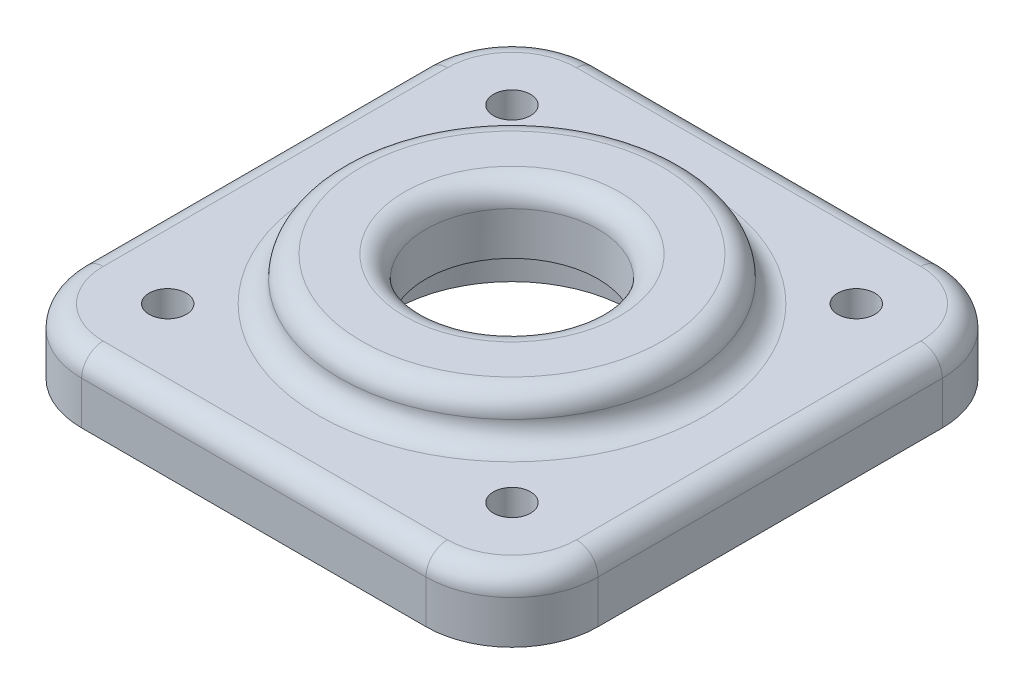
ISO-10303-21;
HEADER;
FILE_DESCRIPTION(('STEP AP214'),'2;1');
FILE_NAME('part.step','',(''),(''),'','','');
FILE_SCHEMA(('AUTOMOTIVE_DESIGN { 1 0 10303 214 1 1 1 1 }'));
ENDSEC;
DATA;
#1=APPLICATION_CONTEXT('core data for automotive mechanical design processes');
#2=APPLICATION_PROTOCOL_DEFINITION('international standard','automotive_design',2000,#1);
#3=PRODUCT_CONTEXT('',#1,'mechanical');
#4=PRODUCT('Part','Part','',(#3));
#5=PRODUCT_RELATED_PRODUCT_CATEGORY('part','',(#4));
#6=PRODUCT_DEFINITION_FORMATION('','',#4);
#7=PRODUCT_DEFINITION_CONTEXT('part definition',#1,'design');
#8=PRODUCT_DEFINITION('design','',#6,#7);
#9=PRODUCT_DEFINITION_SHAPE('','',#8);
#10=(LENGTH_UNIT() NAMED_UNIT(*) SI_UNIT(.MILLI.,.METRE.));
#11=(NAMED_UNIT(*) PLANE_ANGLE_UNIT() SI_UNIT($,.RADIAN.));
#12=(NAMED_UNIT(*) SI_UNIT($,.STERADIAN.) SOLID_ANGLE_UNIT());
#13=UNCERTAINTY_MEASURE_WITH_UNIT(LENGTH_MEASURE(1.E-05),#10,'distance_accuracy_value','');
#14=(GEOMETRIC_REPRESENTATION_CONTEXT(3) GLOBAL_UNCERTAINTY_ASSIGNED_CONTEXT((#13)) GLOBAL_UNIT_ASSIGNED_CONTEXT((#10,
#11,#12)) REPRESENTATION_CONTEXT('',''));
#15=CARTESIAN_POINT('',(0.,0.,0.));
#16=DIRECTION('',(0.,0.,1.));
#17=DIRECTION('',(1.,0.,0.));
#18=AXIS2_PLACEMENT_3D('',#15,#16,#17);
#19=CARTESIAN_POINT('',(-8.,3.,-8.));
#20=DIRECTION('',(0.,1.,0.));
#21=DIRECTION('',(0.,0.,1.));
#22=AXIS2_PLACEMENT_3D('',#19,#20,#21);
#23=PLANE('',#22);
#24=DIRECTION('',(1.,0.,0.));
#25=VECTOR('',#24,1.);
#26=CARTESIAN_POINT('',(7.99999999999998,3.,10.9999999999995));
#27=LINE('',#26,#25);
#28=CARTESIAN_POINT('',(-7.99999999999997,3.,10.9999999999995));
#29=VERTEX_POINT('',#28);
#30=CARTESIAN_POINT('',(7.99999999999998,3.,10.9999999999995));
#31=VERTEX_POINT('',#30);
#32=EDGE_CURVE('E200',#29,#31,#27,.T.);
#33=ORIENTED_EDGE('',*,*,#32,.T.);
#34=CARTESIAN_POINT('',(8.,3.,7.99999999999955));
#35=DIRECTION('',(0.,1.,0.));
#36=DIRECTION('',(0.,0.,1.));
#37=AXIS2_PLACEMENT_3D('',#34,#35,#36);
#38=CIRCLE('',#37,3.);
#39=CARTESIAN_POINT('',(11.,3.,7.99999999999953));
#40=VERTEX_POINT('',#39);
#41=EDGE_CURVE('E202',#31,#40,#38,.T.);
#42=ORIENTED_EDGE('',*,*,#41,.T.);
#43=DIRECTION('',(0.,0.,-1.));
#44=VECTOR('',#43,1.);
#45=CARTESIAN_POINT('',(11.,3.,-7.99999999999997));
#46=LINE('',#45,#44);
#47=CARTESIAN_POINT('',(11.,3.,-7.99999999999998));
#48=VERTEX_POINT('',#47);
#49=EDGE_CURVE('E188',#40,#48,#46,.T.);
#50=ORIENTED_EDGE('',*,*,#49,.T.);
#51=CARTESIAN_POINT('',(8.,3.,-8.));
#52=DIRECTION('',(0.,1.,0.));
#53=DIRECTION('',(0.,0.,1.));
#54=AXIS2_PLACEMENT_3D('',#51,#52,#53);
#55=CIRCLE('',#54,3.);
#56=CARTESIAN_POINT('',(7.99999999999998,3.,-11.));
#57=VERTEX_POINT('',#56);
#58=EDGE_CURVE('E190',#48,#57,#55,.T.);
#59=ORIENTED_EDGE('',*,*,#58,.T.);
#60=DIRECTION('',(-1.,0.,0.));
#61=VECTOR('',#60,1.);
#62=CARTESIAN_POINT('',(-7.99999999999997,3.,-11.));
#63=LINE('',#62,#61);
#64=CARTESIAN_POINT('',(-7.99999999999998,3.,-11.));
#65=VERTEX_POINT('',#64);
#66=EDGE_CURVE('E192',#57,#65,#63,.T.);
#67=ORIENTED_EDGE('',*,*,#66,.T.);
#68=CARTESIAN_POINT('',(-8.,3.,-8.));
#69=DIRECTION('',(0.,1.,0.));
#70=DIRECTION('',(0.,0.,1.));
#71=AXIS2_PLACEMENT_3D('',#68,#69,#70);
#72=CIRCLE('',#71,3.);
#73=CARTESIAN_POINT('',(-11.,3.,-7.99999999999997));
#74=VERTEX_POINT('',#73);
#75=EDGE_CURVE('E194',#65,#74,#72,.T.);
#76=ORIENTED_EDGE('',*,*,#75,.T.);
#77=DIRECTION('',(0.,0.,1.));
#78=VECTOR('',#77,1.);
#79=CARTESIAN_POINT('',(-11.,3.,7.99999999999952));
#80=LINE('',#79,#78);
#81=CARTESIAN_POINT('',(-11.,3.,7.99999999999953));
#82=VERTEX_POINT('',#81);
#83=EDGE_CURVE('E196',#74,#82,#80,.T.);
#84=ORIENTED_EDGE('',*,*,#83,.T.);
#85=CARTESIAN_POINT('',(-8.,3.,7.99999999999955));
#86=DIRECTION('',(0.,1.,0.));
#87=DIRECTION('',(0.,0.,1.));
#88=AXIS2_PLACEMENT_3D('',#85,#86,#87);
#89=CIRCLE('',#88,3.);
#90=EDGE_CURVE('E198',#82,#29,#89,.T.);
#91=ORIENTED_EDGE('',*,*,#90,.T.);
#92=EDGE_LOOP('',(#33,#42,#50,#59,#67,#76,#84,#91));
#93=FACE_BOUND('',#92,.T.);
#94=CARTESIAN_POINT('',(0.,3.,0.));
#95=DIRECTION('',(0.,1.,0.));
#96=DIRECTION('',(0.,0.,1.));
#97=AXIS2_PLACEMENT_3D('',#94,#95,#96);
#98=CIRCLE('',#97,9.);
#99=CARTESIAN_POINT('',(0.,3.,9.));
#100=VERTEX_POINT('',#99);
#101=EDGE_CURVE('E136',#100,#100,#98,.F.);
#102=ORIENTED_EDGE('',*,*,#101,.T.);
#103=EDGE_LOOP('',(#102));
#104=FACE_BOUND('',#103,.T.);
#105=CARTESIAN_POINT('',(-7.99999999999955,3.,8.00000000000001));
#106=DIRECTION('',(0.,1.,0.));
#107=DIRECTION('',(0.,0.,1.));
#108=AXIS2_PLACEMENT_3D('',#105,#106,#107);
#109=CIRCLE('',#108,0.861723990727093);
#110=CARTESIAN_POINT('',(-7.99999999999955,3.,8.8617239907271));
#111=VERTEX_POINT('',#110);
#112=EDGE_CURVE('E259',#111,#111,#109,.T.);
#113=ORIENTED_EDGE('',*,*,#112,.F.);
#114=EDGE_LOOP('',(#113));
#115=FACE_BOUND('',#114,.T.);
#116=CARTESIAN_POINT('',(8.,3.,-8.00000000000045));
#117=DIRECTION('',(0.,1.,0.));
#118=DIRECTION('',(0.,0.,1.));
#119=AXIS2_PLACEMENT_3D('',#116,#117,#118);
#120=CIRCLE('',#119,0.861723990727318);
#121=CARTESIAN_POINT('',(8.,3.,-7.13827600927313));
#122=VERTEX_POINT('',#121);
#123=EDGE_CURVE('E271',#122,#122,#120,.T.);
#124=ORIENTED_EDGE('',*,*,#123,.F.);
#125=EDGE_LOOP('',(#124));
#126=FACE_BOUND('',#125,.T.);
#127=CARTESIAN_POINT('',(-8.,3.,-8.));
#128=DIRECTION('',(0.,1.,0.));
#129=DIRECTION('',(0.,0.,1.));
#130=AXIS2_PLACEMENT_3D('',#127,#128,#129);
#131=CIRCLE('',#130,0.861723990726853);
#132=CARTESIAN_POINT('',(-8.,3.,-7.13827600927315));
#133=VERTEX_POINT('',#132);
#134=EDGE_CURVE('E152',#133,#133,#131,.T.);
#135=ORIENTED_EDGE('',*,*,#134,.F.);
#136=EDGE_LOOP('',(#135));
#137=FACE_BOUND('',#136,.T.);
#138=CARTESIAN_POINT('',(8.00000000000045,3.,7.99999999999955));
#139=DIRECTION('',(0.,1.,0.));
#140=DIRECTION('',(0.,0.,1.));
#141=AXIS2_PLACEMENT_3D('',#138,#139,#140);
#142=CIRCLE('',#141,0.861723990727488);
#143=CARTESIAN_POINT('',(8.00000000000045,3.,8.86172399072704));
#144=VERTEX_POINT('',#143);
#145=EDGE_CURVE('E265',#144,#144,#142,.T.);
#146=ORIENTED_EDGE('',*,*,#145,.F.);
#147=EDGE_LOOP('',(#146));
#148=FACE_BOUND('',#147,.T.);
#149=ADVANCED_FACE('F35',(#93,#104,#115,#126,#137,#148),#23,.T.);
#150=CARTESIAN_POINT('',(-8.,0.,-8.));
#151=DIRECTION('',(0.,1.,0.));
#152=DIRECTION('',(0.,0.,1.));
#153=AXIS2_PLACEMENT_3D('',#150,#151,#152);
#154=PLANE('',#153);
#155=CARTESIAN_POINT('',(8.00000000000045,0.,7.99999999999955));
#156=DIRECTION('',(0.,1.,0.));
#157=DIRECTION('',(0.,0.,1.));
#158=AXIS2_PLACEMENT_3D('',#155,#156,#157);
#159=CIRCLE('',#158,0.861723990727488);
#160=CARTESIAN_POINT('',(8.00000000000045,0.,8.86172399072704));
#161=VERTEX_POINT('',#160);
#162=EDGE_CURVE('E262',#161,#161,#159,.T.);
#163=ORIENTED_EDGE('',*,*,#162,.T.);
#164=EDGE_LOOP('',(#163));
#165=FACE_BOUND('',#164,.T.);
#166=CARTESIAN_POINT('',(0.,0.,0.));
#167=DIRECTION('',(0.,1.,0.));
#168=DIRECTION('',(0.,0.,1.));
#169=AXIS2_PLACEMENT_3D('',#166,#167,#168);
#170=CIRCLE('',#169,5.5);
#171=CARTESIAN_POINT('',(0.,0.,5.5));
#172=VERTEX_POINT('',#171);
#173=EDGE_CURVE('E274',#172,#172,#170,.T.);
#174=ORIENTED_EDGE('',*,*,#173,.T.);
#175=EDGE_LOOP('',(#174));
#176=FACE_BOUND('',#175,.T.);
#177=CARTESIAN_POINT('',(-8.,0.,-8.));
#178=DIRECTION('',(0.,1.,0.));
#179=DIRECTION('',(0.,0.,1.));
#180=AXIS2_PLACEMENT_3D('',#177,#178,#179);
#181=CIRCLE('',#180,4.);
#182=CARTESIAN_POINT('',(-7.99999999999997,0.,-12.));
#183=VERTEX_POINT('',#182);
#184=CARTESIAN_POINT('',(-12.,0.,-7.99999999999997));
#185=VERTEX_POINT('',#184);
#186=EDGE_CURVE('E144',#183,#185,#181,.T.);
#187=ORIENTED_EDGE('',*,*,#186,.F.);
#188=DIRECTION('',(-1.,0.,0.));
#189=VECTOR('',#188,1.);
#190=CARTESIAN_POINT('',(-7.99999999999997,0.,-12.));
#191=LINE('',#190,#189);
#192=CARTESIAN_POINT('',(7.99999999999998,0.,-12.));
#193=VERTEX_POINT('',#192);
#194=EDGE_CURVE('E172',#193,#183,#191,.T.);
#195=ORIENTED_EDGE('',*,*,#194,.F.);
#196=CARTESIAN_POINT('',(8.,0.,-8.));
#197=DIRECTION('',(0.,1.,0.));
#198=DIRECTION('',(0.,0.,-1.));
#199=AXIS2_PLACEMENT_3D('',#196,#197,#198);
#200=CIRCLE('',#199,4.);
#201=CARTESIAN_POINT('',(12.,0.,-7.99999999999997));
#202=VERTEX_POINT('',#201);
#203=EDGE_CURVE('E169',#202,#193,#200,.T.);
#204=ORIENTED_EDGE('',*,*,#203,.F.);
#205=DIRECTION('',(0.,0.,-1.));
#206=VECTOR('',#205,1.);
#207=CARTESIAN_POINT('',(12.,0.,-7.99999999999997));
#208=LINE('',#207,#206);
#209=CARTESIAN_POINT('',(12.,0.,7.99999999999952));
#210=VERTEX_POINT('',#209);
#211=EDGE_CURVE('E166',#210,#202,#208,.T.);
#212=ORIENTED_EDGE('',*,*,#211,.F.);
#213=CARTESIAN_POINT('',(8.,0.,7.99999999999955));
#214=DIRECTION('',(0.,1.,0.));
#215=DIRECTION('',(0.,0.,1.));
#216=AXIS2_PLACEMENT_3D('',#213,#214,#215);
#217=CIRCLE('',#216,4.);
#218=CARTESIAN_POINT('',(7.99999999999998,0.,11.9999999999995));
#219=VERTEX_POINT('',#218);
#220=EDGE_CURVE('E163',#219,#210,#217,.T.);
#221=ORIENTED_EDGE('',*,*,#220,.F.);
#222=DIRECTION('',(1.,0.,0.));
#223=VECTOR('',#222,1.);
#224=CARTESIAN_POINT('',(-7.99999999999997,0.,11.9999999999995));
#225=LINE('',#224,#223);
#226=CARTESIAN_POINT('',(-7.99999999999997,0.,11.9999999999995));
#227=VERTEX_POINT('',#226);
#228=EDGE_CURVE('E160',#227,#219,#225,.T.);
#229=ORIENTED_EDGE('',*,*,#228,.F.);
#230=CARTESIAN_POINT('',(-8.,0.,7.99999999999955));
#231=DIRECTION('',(0.,1.,0.));
#232=DIRECTION('',(0.,0.,1.));
#233=AXIS2_PLACEMENT_3D('',#230,#231,#232);
#234=CIRCLE('',#233,4.);
#235=CARTESIAN_POINT('',(-12.,0.,7.99999999999952));
#236=VERTEX_POINT('',#235);
#237=EDGE_CURVE('E147',#236,#227,#234,.T.);
#238=ORIENTED_EDGE('',*,*,#237,.F.);
#239=DIRECTION('',(0.,0.,1.));
#240=VECTOR('',#239,1.);
#241=CARTESIAN_POINT('',(-12.,0.,-7.99999999999997));
#242=LINE('',#241,#240);
#243=EDGE_CURVE('E129',#185,#236,#242,.T.);
#244=ORIENTED_EDGE('',*,*,#243,.F.);
#245=EDGE_LOOP('',(#187,#195,#204,#212,#221,#229,#238,#244));
#246=FACE_BOUND('',#245,.T.);
#247=CARTESIAN_POINT('',(-8.,0.,-8.));
#248=DIRECTION('',(0.,1.,0.));
#249=DIRECTION('',(0.,0.,1.));
#250=AXIS2_PLACEMENT_3D('',#247,#248,#249);
#251=CIRCLE('',#250,0.861723990726853);
#252=CARTESIAN_POINT('',(-8.,0.,-7.13827600927315));
#253=VERTEX_POINT('',#252);
#254=EDGE_CURVE('E155',#253,#253,#251,.T.);
#255=ORIENTED_EDGE('',*,*,#254,.T.);
#256=EDGE_LOOP('',(#255));
#257=FACE_BOUND('',#256,.T.);
#258=CARTESIAN_POINT('',(8.,0.,-8.00000000000045));
#259=DIRECTION('',(0.,1.,0.));
#260=DIRECTION('',(0.,0.,1.));
#261=AXIS2_PLACEMENT_3D('',#258,#259,#260);
#262=CIRCLE('',#261,0.861723990727318);
#263=CARTESIAN_POINT('',(8.,0.,-7.13827600927313));
#264=VERTEX_POINT('',#263);
#265=EDGE_CURVE('E268',#264,#264,#262,.T.);
#266=ORIENTED_EDGE('',*,*,#265,.T.);
#267=EDGE_LOOP('',(#266));
#268=FACE_BOUND('',#267,.T.);
#269=CARTESIAN_POINT('',(-7.99999999999955,0.,8.00000000000001));
#270=DIRECTION('',(0.,1.,0.));
#271=DIRECTION('',(0.,0.,1.));
#272=AXIS2_PLACEMENT_3D('',#269,#270,#271);
#273=CIRCLE('',#272,0.861723990727093);
#274=CARTESIAN_POINT('',(-7.99999999999955,0.,8.8617239907271));
#275=VERTEX_POINT('',#274);
#276=EDGE_CURVE('E249',#275,#275,#273,.T.);
#277=ORIENTED_EDGE('',*,*,#276,.T.);
#278=EDGE_LOOP('',(#277));
#279=FACE_BOUND('',#278,.T.);
#280=ADVANCED_FACE('F141',(#165,#176,#246,#257,#268,#279),#154,.F.);
#281=CARTESIAN_POINT('',(-8.,3.,-8.));
#282=DIRECTION('',(0.,-1.,0.));
#283=DIRECTION('',(0.,0.,-1.));
#284=AXIS2_PLACEMENT_3D('',#281,#282,#283);
#285=CYLINDRICAL_SURFACE('',#284,4.);
#286=DIRECTION('',(0.,-1.,0.));
#287=VECTOR('',#286,1.);
#288=CARTESIAN_POINT('',(-12.,3.,-7.99999999999997));
#289=LINE('',#288,#287);
#290=CARTESIAN_POINT('',(-12.,2.,-7.99999999999997));
#291=VERTEX_POINT('',#290);
#292=EDGE_CURVE('E125',#291,#185,#289,.T.);
#293=ORIENTED_EDGE('',*,*,#292,.F.);
#294=CARTESIAN_POINT('',(-8.,2.,-8.));
#295=DIRECTION('',(0.,1.,0.));
#296=DIRECTION('',(0.,0.,1.));
#297=AXIS2_PLACEMENT_3D('',#294,#295,#296);
#298=CIRCLE('',#297,4.);
#299=CARTESIAN_POINT('',(-7.99999999999997,2.,-12.));
#300=VERTEX_POINT('',#299);
#301=EDGE_CURVE('E213',#291,#300,#298,.F.);
#302=ORIENTED_EDGE('',*,*,#301,.T.);
#303=DIRECTION('',(0.,-1.,0.));
#304=VECTOR('',#303,1.);
#305=CARTESIAN_POINT('',(-7.99999999999997,3.,-12.));
#306=LINE('',#305,#304);
#307=EDGE_CURVE('E150',#300,#183,#306,.T.);
#308=ORIENTED_EDGE('',*,*,#307,.T.);
#309=ORIENTED_EDGE('',*,*,#186,.T.);
#310=EDGE_LOOP('',(#293,#302,#308,#309));
#311=FACE_BOUND('',#310,.T.);
#312=ADVANCED_FACE('F149',(#311),#285,.T.);
#313=CARTESIAN_POINT('',(-12.,3.,-7.99999999999997));
#314=DIRECTION('',(1.,0.,0.));
#315=DIRECTION('',(0.,0.,-1.));
#316=AXIS2_PLACEMENT_3D('',#313,#314,#315);
#317=PLANE('',#316);
#318=DIRECTION('',(0.,-1.,0.));
#319=VECTOR('',#318,1.);
#320=CARTESIAN_POINT('',(-12.,3.,7.99999999999952));
#321=LINE('',#320,#319);
#322=CARTESIAN_POINT('',(-12.,2.,7.99999999999952));
#323=VERTEX_POINT('',#322);
#324=EDGE_CURVE('E137',#323,#236,#321,.T.);
#325=ORIENTED_EDGE('',*,*,#324,.F.);
#326=DIRECTION('',(0.,0.,1.));
#327=VECTOR('',#326,1.);
#328=CARTESIAN_POINT('',(-12.,2.,-7.99999999999997));
#329=LINE('',#328,#327);
#330=EDGE_CURVE('E132',#323,#291,#329,.F.);
#331=ORIENTED_EDGE('',*,*,#330,.T.);
#332=ORIENTED_EDGE('',*,*,#292,.T.);
#333=ORIENTED_EDGE('',*,*,#243,.T.);
#334=EDGE_LOOP('',(#325,#331,#332,#333));
#335=FACE_BOUND('',#334,.T.);
#336=ADVANCED_FACE('F128',(#335),#317,.F.);
#337=CARTESIAN_POINT('',(-8.,3.,7.99999999999955));
#338=DIRECTION('',(0.,-1.,0.));
#339=DIRECTION('',(0.,0.,-1.));
#340=AXIS2_PLACEMENT_3D('',#337,#338,#339);
#341=CYLINDRICAL_SURFACE('',#340,4.);
#342=DIRECTION('',(0.,-1.,0.));
#343=VECTOR('',#342,1.);
#344=CARTESIAN_POINT('',(-7.99999999999997,3.,11.9999999999995));
#345=LINE('',#344,#343);
#346=CARTESIAN_POINT('',(-7.99999999999997,2.,11.9999999999995));
#347=VERTEX_POINT('',#346);
#348=EDGE_CURVE('E183',#347,#227,#345,.T.);
#349=ORIENTED_EDGE('',*,*,#348,.F.);
#350=CARTESIAN_POINT('',(-8.,2.,7.99999999999955));
#351=DIRECTION('',(0.,1.,0.));
#352=DIRECTION('',(0.,0.,1.));
#353=AXIS2_PLACEMENT_3D('',#350,#351,#352);
#354=CIRCLE('',#353,4.);
#355=EDGE_CURVE('E210',#347,#323,#354,.F.);
#356=ORIENTED_EDGE('',*,*,#355,.T.);
#357=ORIENTED_EDGE('',*,*,#324,.T.);
#358=ORIENTED_EDGE('',*,*,#237,.T.);
#359=EDGE_LOOP('',(#349,#356,#357,#358));
#360=FACE_BOUND('',#359,.T.);
#361=ADVANCED_FACE('F322',(#360),#341,.T.);
#362=CARTESIAN_POINT('',(-7.99999999999997,3.,11.9999999999995));
#363=DIRECTION('',(0.,0.,-1.));
#364=DIRECTION('',(-1.,0.,0.));
#365=AXIS2_PLACEMENT_3D('',#362,#363,#364);
#366=PLANE('',#365);
#367=DIRECTION('',(0.,-1.,0.));
#368=VECTOR('',#367,1.);
#369=CARTESIAN_POINT('',(7.99999999999998,3.,11.9999999999995));
#370=LINE('',#369,#368);
#371=CARTESIAN_POINT('',(7.99999999999998,2.,11.9999999999995));
#372=VERTEX_POINT('',#371);
#373=EDGE_CURVE('E181',#372,#219,#370,.T.);
#374=ORIENTED_EDGE('',*,*,#373,.F.);
#375=DIRECTION('',(1.,0.,0.));
#376=VECTOR('',#375,1.);
#377=CARTESIAN_POINT('',(-7.99999999999997,2.,11.9999999999995));
#378=LINE('',#377,#376);
#379=EDGE_CURVE('E208',#372,#347,#378,.F.);
#380=ORIENTED_EDGE('',*,*,#379,.T.);
#381=ORIENTED_EDGE('',*,*,#348,.T.);
#382=ORIENTED_EDGE('',*,*,#228,.T.);
#383=EDGE_LOOP('',(#374,#380,#381,#382));
#384=FACE_BOUND('',#383,.T.);
#385=ADVANCED_FACE('F318',(#384),#366,.F.);
#386=CARTESIAN_POINT('',(8.,3.,7.99999999999955));
#387=DIRECTION('',(0.,-1.,0.));
#388=DIRECTION('',(0.,0.,-1.));
#389=AXIS2_PLACEMENT_3D('',#386,#387,#388);
#390=CYLINDRICAL_SURFACE('',#389,4.);
#391=DIRECTION('',(0.,-1.,0.));
#392=VECTOR('',#391,1.);
#393=CARTESIAN_POINT('',(12.,3.,7.99999999999952));
#394=LINE('',#393,#392);
#395=CARTESIAN_POINT('',(12.,2.,7.99999999999952));
#396=VERTEX_POINT('',#395);
#397=EDGE_CURVE('E179',#396,#210,#394,.T.);
#398=ORIENTED_EDGE('',*,*,#397,.F.);
#399=CARTESIAN_POINT('',(8.,2.,7.99999999999955));
#400=DIRECTION('',(0.,1.,0.));
#401=DIRECTION('',(0.,0.,1.));
#402=AXIS2_PLACEMENT_3D('',#399,#400,#401);
#403=CIRCLE('',#402,4.);
#404=EDGE_CURVE('E205',#396,#372,#403,.F.);
#405=ORIENTED_EDGE('',*,*,#404,.T.);
#406=ORIENTED_EDGE('',*,*,#373,.T.);
#407=ORIENTED_EDGE('',*,*,#220,.T.);
#408=EDGE_LOOP('',(#398,#405,#406,#407));
#409=FACE_BOUND('',#408,.T.);
#410=ADVANCED_FACE('F314',(#409),#390,.T.);
#411=CARTESIAN_POINT('',(12.,3.,-7.99999999999997));
#412=DIRECTION('',(-1.,0.,0.));
#413=DIRECTION('',(0.,0.,1.));
#414=AXIS2_PLACEMENT_3D('',#411,#412,#413);
#415=PLANE('',#414);
#416=DIRECTION('',(0.,-1.,0.));
#417=VECTOR('',#416,1.);
#418=CARTESIAN_POINT('',(12.,3.,-7.99999999999997));
#419=LINE('',#418,#417);
#420=CARTESIAN_POINT('',(12.,2.,-7.99999999999997));
#421=VERTEX_POINT('',#420);
#422=EDGE_CURVE('E177',#421,#202,#419,.T.);
#423=ORIENTED_EDGE('',*,*,#422,.F.);
#424=DIRECTION('',(0.,0.,-1.));
#425=VECTOR('',#424,1.);
#426=CARTESIAN_POINT('',(12.,2.,7.99999999999952));
#427=LINE('',#426,#425);
#428=EDGE_CURVE('E43',#421,#396,#427,.F.);
#429=ORIENTED_EDGE('',*,*,#428,.T.);
#430=ORIENTED_EDGE('',*,*,#397,.T.);
#431=ORIENTED_EDGE('',*,*,#211,.T.);
#432=EDGE_LOOP('',(#423,#429,#430,#431));
#433=FACE_BOUND('',#432,.T.);
#434=ADVANCED_FACE('F311',(#433),#415,.F.);
#435=CARTESIAN_POINT('',(8.,3.,-8.));
#436=DIRECTION('',(0.,-1.,0.));
#437=DIRECTION('',(0.,0.,-1.));
#438=AXIS2_PLACEMENT_3D('',#435,#436,#437);
#439=CYLINDRICAL_SURFACE('',#438,4.);
#440=DIRECTION('',(0.,-1.,0.));
#441=VECTOR('',#440,1.);
#442=CARTESIAN_POINT('',(7.99999999999998,3.,-12.));
#443=LINE('',#442,#441);
#444=CARTESIAN_POINT('',(7.99999999999998,2.,-12.));
#445=VERTEX_POINT('',#444);
#446=EDGE_CURVE('E175',#445,#193,#443,.T.);
#447=ORIENTED_EDGE('',*,*,#446,.F.);
#448=CARTESIAN_POINT('',(8.,2.,-8.));
#449=DIRECTION('',(0.,1.,0.));
#450=DIRECTION('',(0.,0.,1.));
#451=AXIS2_PLACEMENT_3D('',#448,#449,#450);
#452=CIRCLE('',#451,4.);
#453=EDGE_CURVE('E50',#445,#421,#452,.F.);
#454=ORIENTED_EDGE('',*,*,#453,.T.);
#455=ORIENTED_EDGE('',*,*,#422,.T.);
#456=ORIENTED_EDGE('',*,*,#203,.T.);
#457=EDGE_LOOP('',(#447,#454,#455,#456));
#458=FACE_BOUND('',#457,.T.);
#459=ADVANCED_FACE('F297',(#458),#439,.T.);
#460=CARTESIAN_POINT('',(-7.99999999999997,3.,-12.));
#461=DIRECTION('',(0.,0.,1.));
#462=DIRECTION('',(1.,0.,0.));
#463=AXIS2_PLACEMENT_3D('',#460,#461,#462);
#464=PLANE('',#463);
#465=ORIENTED_EDGE('',*,*,#307,.F.);
#466=DIRECTION('',(-1.,0.,0.));
#467=VECTOR('',#466,1.);
#468=CARTESIAN_POINT('',(7.99999999999998,2.,-12.));
#469=LINE('',#468,#467);
#470=EDGE_CURVE('E58',#300,#445,#469,.F.);
#471=ORIENTED_EDGE('',*,*,#470,.T.);
#472=ORIENTED_EDGE('',*,*,#446,.T.);
#473=ORIENTED_EDGE('',*,*,#194,.T.);
#474=EDGE_LOOP('',(#465,#471,#472,#473));
#475=FACE_BOUND('',#474,.T.);
#476=ADVANCED_FACE('F287',(#475),#464,.F.);
#477=CARTESIAN_POINT('',(-8.,3.,-8.));
#478=DIRECTION('',(0.,-1.,0.));
#479=DIRECTION('',(0.,0.,-1.));
#480=AXIS2_PLACEMENT_3D('',#477,#478,#479);
#481=CYLINDRICAL_SURFACE('',#480,0.861723990726853);
#482=ORIENTED_EDGE('',*,*,#134,.T.);
#483=EDGE_LOOP('',(#482));
#484=FACE_BOUND('',#483,.T.);
#485=ORIENTED_EDGE('',*,*,#254,.F.);
#486=EDGE_LOOP('',(#485));
#487=FACE_BOUND('',#486,.T.);
#488=ADVANCED_FACE('F284',(#484,#487),#481,.F.);
#489=CARTESIAN_POINT('',(0.,3.,0.));
#490=DIRECTION('',(0.,-1.,0.));
#491=DIRECTION('',(0.,0.,-1.));
#492=AXIS2_PLACEMENT_3D('',#489,#490,#491);
#493=CYLINDRICAL_SURFACE('',#492,5.5);
#494=CARTESIAN_POINT('',(0.,2.,0.));
#495=DIRECTION('',(0.,-1.,0.));
#496=DIRECTION('',(0.,0.,-1.));
#497=AXIS2_PLACEMENT_3D('',#494,#495,#496);
#498=CIRCLE('',#497,5.5);
#499=CARTESIAN_POINT('',(0.,2.,-5.5));
#500=VERTEX_POINT('',#499);
#501=EDGE_CURVE('E11',#500,#500,#498,.T.);
#502=ORIENTED_EDGE('',*,*,#501,.F.);
#503=EDGE_LOOP('',(#502));
#504=FACE_BOUND('',#503,.T.);
#505=ORIENTED_EDGE('',*,*,#173,.F.);
#506=EDGE_LOOP('',(#505));
#507=FACE_BOUND('',#506,.T.);
#508=ADVANCED_FACE('F286',(#504,#507),#493,.F.);
#509=CARTESIAN_POINT('',(8.,3.,-8.00000000000045));
#510=DIRECTION('',(0.,-1.,0.));
#511=DIRECTION('',(0.,0.,-1.));
#512=AXIS2_PLACEMENT_3D('',#509,#510,#511);
#513=CYLINDRICAL_SURFACE('',#512,0.861723990727318);
#514=ORIENTED_EDGE('',*,*,#123,.T.);
#515=EDGE_LOOP('',(#514));
#516=FACE_BOUND('',#515,.T.);
#517=ORIENTED_EDGE('',*,*,#265,.F.);
#518=EDGE_LOOP('',(#517));
#519=FACE_BOUND('',#518,.T.);
#520=ADVANCED_FACE('F294',(#516,#519),#513,.F.);
#521=CARTESIAN_POINT('',(8.00000000000045,3.,7.99999999999955));
#522=DIRECTION('',(0.,-1.,0.));
#523=DIRECTION('',(0.,0.,-1.));
#524=AXIS2_PLACEMENT_3D('',#521,#522,#523);
#525=CYLINDRICAL_SURFACE('',#524,0.861723990727488);
#526=ORIENTED_EDGE('',*,*,#145,.T.);
#527=EDGE_LOOP('',(#526));
#528=FACE_BOUND('',#527,.T.);
#529=ORIENTED_EDGE('',*,*,#162,.F.);
#530=EDGE_LOOP('',(#529));
#531=FACE_BOUND('',#530,.T.);
#532=ADVANCED_FACE('F388',(#528,#531),#525,.F.);
#533=CARTESIAN_POINT('',(-7.99999999999955,3.,8.00000000000001));
#534=DIRECTION('',(0.,-1.,0.));
#535=DIRECTION('',(0.,0.,-1.));
#536=AXIS2_PLACEMENT_3D('',#533,#534,#535);
#537=CYLINDRICAL_SURFACE('',#536,0.861723990727093);
#538=ORIENTED_EDGE('',*,*,#112,.T.);
#539=EDGE_LOOP('',(#538));
#540=FACE_BOUND('',#539,.T.);
#541=ORIENTED_EDGE('',*,*,#276,.F.);
#542=EDGE_LOOP('',(#541));
#543=FACE_BOUND('',#542,.T.);
#544=ADVANCED_FACE('F391',(#540,#543),#537,.F.);
#545=CARTESIAN_POINT('',(0.,5.,0.));
#546=DIRECTION('',(0.,1.,0.));
#547=DIRECTION('',(0.,0.,1.));
#548=AXIS2_PLACEMENT_3D('',#545,#546,#547);
#549=PLANE('',#548);
#550=CARTESIAN_POINT('',(0.,5.,0.));
#551=DIRECTION('',(0.,1.,0.));
#552=DIRECTION('',(0.,0.,1.));
#553=AXIS2_PLACEMENT_3D('',#550,#551,#552);
#554=CIRCLE('',#553,5.);
#555=CARTESIAN_POINT('',(0.,5.,5.));
#556=VERTEX_POINT('',#555);
#557=EDGE_CURVE('E223',#556,#556,#554,.F.);
#558=ORIENTED_EDGE('',*,*,#557,.T.);
#559=EDGE_LOOP('',(#558));
#560=FACE_BOUND('',#559,.T.);
#561=CARTESIAN_POINT('',(0.,5.,0.));
#562=DIRECTION('',(0.,1.,0.));
#563=DIRECTION('',(0.,0.,1.));
#564=AXIS2_PLACEMENT_3D('',#561,#562,#563);
#565=CIRCLE('',#564,7.);
#566=CARTESIAN_POINT('',(0.,5.,7.));
#567=VERTEX_POINT('',#566);
#568=EDGE_CURVE('E220',#567,#567,#565,.T.);
#569=ORIENTED_EDGE('',*,*,#568,.T.);
#570=EDGE_LOOP('',(#569));
#571=FACE_BOUND('',#570,.T.);
#572=ADVANCED_FACE('F398',(#560,#571),#549,.T.);
#573=CARTESIAN_POINT('',(0.,5.,0.));
#574=DIRECTION('',(0.,-1.,0.));
#575=DIRECTION('',(0.,0.,-1.));
#576=AXIS2_PLACEMENT_3D('',#573,#574,#575);
#577=CYLINDRICAL_SURFACE('',#576,4.);
#578=CARTESIAN_POINT('',(0.,4.,0.));
#579=DIRECTION('',(0.,1.,0.));
#580=DIRECTION('',(0.,0.,1.));
#581=AXIS2_PLACEMENT_3D('',#578,#579,#580);
#582=CIRCLE('',#581,4.);
#583=CARTESIAN_POINT('',(0.,4.,4.));
#584=VERTEX_POINT('',#583);
#585=EDGE_CURVE('E217',#584,#584,#582,.T.);
#586=ORIENTED_EDGE('',*,*,#585,.T.);
#587=EDGE_LOOP('',(#586));
#588=FACE_BOUND('',#587,.T.);
#589=CARTESIAN_POINT('',(0.,2.,0.));
#590=DIRECTION('',(0.,-1.,0.));
#591=DIRECTION('',(0.,0.,-1.));
#592=AXIS2_PLACEMENT_3D('',#589,#590,#591);
#593=CIRCLE('',#592,4.);
#594=CARTESIAN_POINT('',(0.,2.,-4.));
#595=VERTEX_POINT('',#594);
#596=EDGE_CURVE('E251',#595,#595,#593,.T.);
#597=ORIENTED_EDGE('',*,*,#596,.T.);
#598=EDGE_LOOP('',(#597));
#599=FACE_BOUND('',#598,.T.);
#600=ADVANCED_FACE('F363',(#588,#599),#577,.F.);
#601=CARTESIAN_POINT('',(-8.,2.,-8.));
#602=DIRECTION('',(0.,1.,0.));
#603=DIRECTION('',(0.,0.,1.));
#604=AXIS2_PLACEMENT_3D('',#601,#602,#603);
#605=TOROIDAL_SURFACE('',#604,3.,1.);
#606=CARTESIAN_POINT('',(-7.99999999999998,2.,-11.));
#607=DIRECTION('',(1.,0.,0.));
#608=DIRECTION('',(0.,0.,-1.));
#609=AXIS2_PLACEMENT_3D('',#606,#607,#608);
#610=CIRCLE('',#609,1.);
#611=EDGE_CURVE('E244',#300,#65,#610,.T.);
#612=ORIENTED_EDGE('',*,*,#611,.F.);
#613=ORIENTED_EDGE('',*,*,#301,.F.);
#614=CARTESIAN_POINT('',(-11.,2.,-7.99999999999997));
#615=DIRECTION('',(0.,0.,1.));
#616=DIRECTION('',(1.,0.,0.));
#617=AXIS2_PLACEMENT_3D('',#614,#615,#616);
#618=CIRCLE('',#617,1.);
#619=EDGE_CURVE('E247',#74,#291,#618,.T.);
#620=ORIENTED_EDGE('',*,*,#619,.F.);
#621=ORIENTED_EDGE('',*,*,#75,.F.);
#622=EDGE_LOOP('',(#612,#613,#620,#621));
#623=FACE_BOUND('',#622,.T.);
#624=ADVANCED_FACE('F359',(#623),#605,.T.);
#625=CARTESIAN_POINT('',(-11.,2.,-8.));
#626=DIRECTION('',(0.,0.,-1.));
#627=DIRECTION('',(-1.,0.,0.));
#628=AXIS2_PLACEMENT_3D('',#625,#626,#627);
#629=CYLINDRICAL_SURFACE('',#628,1.);
#630=ORIENTED_EDGE('',*,*,#619,.T.);
#631=ORIENTED_EDGE('',*,*,#330,.F.);
#632=CARTESIAN_POINT('',(-11.,2.,7.99999999999953));
#633=DIRECTION('',(0.,0.,1.));
#634=DIRECTION('',(1.,0.,0.));
#635=AXIS2_PLACEMENT_3D('',#632,#633,#634);
#636=CIRCLE('',#635,1.);
#637=EDGE_CURVE('E241',#82,#323,#636,.T.);
#638=ORIENTED_EDGE('',*,*,#637,.F.);
#639=ORIENTED_EDGE('',*,*,#83,.F.);
#640=EDGE_LOOP('',(#630,#631,#638,#639));
#641=FACE_BOUND('',#640,.T.);
#642=ADVANCED_FACE('F355',(#641),#629,.T.);
#643=CARTESIAN_POINT('',(-8.,2.,-11.));
#644=DIRECTION('',(1.,0.,0.));
#645=DIRECTION('',(0.,0.,-1.));
#646=AXIS2_PLACEMENT_3D('',#643,#644,#645);
#647=CYLINDRICAL_SURFACE('',#646,1.);
#648=ORIENTED_EDGE('',*,*,#611,.T.);
#649=ORIENTED_EDGE('',*,*,#66,.F.);
#650=CARTESIAN_POINT('',(7.99999999999998,2.,-11.));
#651=DIRECTION('',(1.,0.,0.));
#652=DIRECTION('',(0.,0.,-1.));
#653=AXIS2_PLACEMENT_3D('',#650,#651,#652);
#654=CIRCLE('',#653,1.);
#655=EDGE_CURVE('E238',#445,#57,#654,.T.);
#656=ORIENTED_EDGE('',*,*,#655,.F.);
#657=ORIENTED_EDGE('',*,*,#470,.F.);
#658=EDGE_LOOP('',(#648,#649,#656,#657));
#659=FACE_BOUND('',#658,.T.);
#660=ADVANCED_FACE('F351',(#659),#647,.T.);
#661=CARTESIAN_POINT('',(-8.,2.,7.99999999999955));
#662=DIRECTION('',(0.,1.,0.));
#663=DIRECTION('',(0.,0.,1.));
#664=AXIS2_PLACEMENT_3D('',#661,#662,#663);
#665=TOROIDAL_SURFACE('',#664,3.,1.);
#666=ORIENTED_EDGE('',*,*,#637,.T.);
#667=ORIENTED_EDGE('',*,*,#355,.F.);
#668=CARTESIAN_POINT('',(-7.99999999999997,2.,10.9999999999995));
#669=DIRECTION('',(1.,0.,0.));
#670=DIRECTION('',(0.,0.,-1.));
#671=AXIS2_PLACEMENT_3D('',#668,#669,#670);
#672=CIRCLE('',#671,1.);
#673=EDGE_CURVE('E235',#29,#347,#672,.T.);
#674=ORIENTED_EDGE('',*,*,#673,.F.);
#675=ORIENTED_EDGE('',*,*,#90,.F.);
#676=EDGE_LOOP('',(#666,#667,#674,#675));
#677=FACE_BOUND('',#676,.T.);
#678=ADVANCED_FACE('F347',(#677),#665,.T.);
#679=CARTESIAN_POINT('',(8.,2.,-8.));
#680=DIRECTION('',(0.,1.,0.));
#681=DIRECTION('',(0.,0.,1.));
#682=AXIS2_PLACEMENT_3D('',#679,#680,#681);
#683=TOROIDAL_SURFACE('',#682,3.,1.);
#684=ORIENTED_EDGE('',*,*,#655,.T.);
#685=ORIENTED_EDGE('',*,*,#58,.F.);
#686=CARTESIAN_POINT('',(11.,2.,-7.99999999999998));
#687=DIRECTION('',(0.,0.,1.));
#688=DIRECTION('',(1.,0.,0.));
#689=AXIS2_PLACEMENT_3D('',#686,#687,#688);
#690=CIRCLE('',#689,1.);
#691=EDGE_CURVE('E232',#421,#48,#690,.T.);
#692=ORIENTED_EDGE('',*,*,#691,.F.);
#693=ORIENTED_EDGE('',*,*,#453,.F.);
#694=EDGE_LOOP('',(#684,#685,#692,#693));
#695=FACE_BOUND('',#694,.T.);
#696=ADVANCED_FACE('F343',(#695),#683,.T.);
#697=CARTESIAN_POINT('',(-8.,2.,10.9999999999995));
#698=DIRECTION('',(-1.,0.,0.));
#699=DIRECTION('',(0.,0.,1.));
#700=AXIS2_PLACEMENT_3D('',#697,#698,#699);
#701=CYLINDRICAL_SURFACE('',#700,1.);
#702=ORIENTED_EDGE('',*,*,#673,.T.);
#703=ORIENTED_EDGE('',*,*,#379,.F.);
#704=CARTESIAN_POINT('',(7.99999999999998,2.,10.9999999999995));
#705=DIRECTION('',(1.,0.,0.));
#706=DIRECTION('',(0.,0.,-1.));
#707=AXIS2_PLACEMENT_3D('',#704,#705,#706);
#708=CIRCLE('',#707,1.);
#709=EDGE_CURVE('E229',#31,#372,#708,.T.);
#710=ORIENTED_EDGE('',*,*,#709,.F.);
#711=ORIENTED_EDGE('',*,*,#32,.F.);
#712=EDGE_LOOP('',(#702,#703,#710,#711));
#713=FACE_BOUND('',#712,.T.);
#714=ADVANCED_FACE('F339',(#713),#701,.T.);
#715=CARTESIAN_POINT('',(11.,2.,-8.));
#716=DIRECTION('',(0.,0.,1.));
#717=DIRECTION('',(1.,0.,0.));
#718=AXIS2_PLACEMENT_3D('',#715,#716,#717);
#719=CYLINDRICAL_SURFACE('',#718,1.);
#720=ORIENTED_EDGE('',*,*,#691,.T.);
#721=ORIENTED_EDGE('',*,*,#49,.F.);
#722=CARTESIAN_POINT('',(11.,2.,7.99999999999952));
#723=DIRECTION('',(0.,0.,1.));
#724=DIRECTION('',(0.,-1.,0.));
#725=AXIS2_PLACEMENT_3D('',#722,#723,#724);
#726=CIRCLE('',#725,1.);
#727=EDGE_CURVE('E227',#396,#40,#726,.T.);
#728=ORIENTED_EDGE('',*,*,#727,.F.);
#729=ORIENTED_EDGE('',*,*,#428,.F.);
#730=EDGE_LOOP('',(#720,#721,#728,#729));
#731=FACE_BOUND('',#730,.T.);
#732=ADVANCED_FACE('F335',(#731),#719,.T.);
#733=CARTESIAN_POINT('',(8.,2.,7.99999999999955));
#734=DIRECTION('',(0.,1.,0.));
#735=DIRECTION('',(0.,0.,1.));
#736=AXIS2_PLACEMENT_3D('',#733,#734,#735);
#737=TOROIDAL_SURFACE('',#736,3.,1.);
#738=ORIENTED_EDGE('',*,*,#709,.T.);
#739=ORIENTED_EDGE('',*,*,#404,.F.);
#740=ORIENTED_EDGE('',*,*,#727,.T.);
#741=ORIENTED_EDGE('',*,*,#41,.F.);
#742=EDGE_LOOP('',(#738,#739,#740,#741));
#743=FACE_BOUND('',#742,.T.);
#744=ADVANCED_FACE('F331',(#743),#737,.T.);
#745=CARTESIAN_POINT('',(0.,4.,0.));
#746=DIRECTION('',(0.,1.,0.));
#747=DIRECTION('',(0.,0.,1.));
#748=AXIS2_PLACEMENT_3D('',#745,#746,#747);
#749=TOROIDAL_SURFACE('',#748,5.,1.);
#750=ORIENTED_EDGE('',*,*,#557,.F.);
#751=EDGE_LOOP('',(#750));
#752=FACE_BOUND('',#751,.T.);
#753=ORIENTED_EDGE('',*,*,#585,.F.);
#754=EDGE_LOOP('',(#753));
#755=FACE_BOUND('',#754,.T.);
#756=ADVANCED_FACE('F334',(#752,#755),#749,.T.);
#757=CARTESIAN_POINT('',(0.,4.,0.));
#758=DIRECTION('',(0.,1.,0.));
#759=DIRECTION('',(0.,0.,1.));
#760=AXIS2_PLACEMENT_3D('',#757,#758,#759);
#761=TOROIDAL_SURFACE('',#760,7.,1.);
#762=ORIENTED_EDGE('',*,*,#568,.F.);
#763=EDGE_LOOP('',(#762));
#764=FACE_BOUND('',#763,.T.);
#765=CARTESIAN_POINT('',(0.,4.,0.));
#766=DIRECTION('',(0.,1.,0.));
#767=DIRECTION('',(0.,0.,1.));
#768=AXIS2_PLACEMENT_3D('',#765,#766,#767);
#769=CIRCLE('',#768,8.);
#770=CARTESIAN_POINT('',(0.,4.,8.));
#771=VERTEX_POINT('',#770);
#772=EDGE_CURVE('E230',#771,#771,#769,.F.);
#773=ORIENTED_EDGE('',*,*,#772,.F.);
#774=EDGE_LOOP('',(#773));
#775=FACE_BOUND('',#774,.T.);
#776=ADVANCED_FACE('F37',(#764,#775),#761,.T.);
#777=CARTESIAN_POINT('',(0.,4.,0.));
#778=DIRECTION('',(0.,1.,0.));
#779=DIRECTION('',(0.,0.,1.));
#780=AXIS2_PLACEMENT_3D('',#777,#778,#779);
#781=TOROIDAL_SURFACE('',#780,9.,1.);
#782=ORIENTED_EDGE('',*,*,#101,.F.);
#783=EDGE_LOOP('',(#782));
#784=FACE_BOUND('',#783,.T.);
#785=ORIENTED_EDGE('',*,*,#772,.T.);
#786=EDGE_LOOP('',(#785));
#787=FACE_BOUND('',#786,.T.);
#788=ADVANCED_FACE('F367',(#784,#787),#781,.F.);
#789=CARTESIAN_POINT('',(0.,2.,0.));
#790=DIRECTION('',(0.,-1.,0.));
#791=DIRECTION('',(0.,0.,-1.));
#792=AXIS2_PLACEMENT_3D('',#789,#790,#791);
#793=PLANE('',#792);
#794=ORIENTED_EDGE('',*,*,#501,.T.);
#795=EDGE_LOOP('',(#794));
#796=FACE_BOUND('',#795,.T.);
#797=ORIENTED_EDGE('',*,*,#596,.F.);
#798=EDGE_LOOP('',(#797));
#799=FACE_BOUND('',#798,.T.);
#800=ADVANCED_FACE('F369',(#796,#799),#793,.T.);
#801=CLOSED_SHELL('',(#149,#280,#312,#336,#361,#385,#410,#434,#459,#476,#488,#508,#520,#532,
#544,#572,#600,#624,#642,#660,#678,#696,#714,#732,#744,#756,#776,#788,#800));
#802=MANIFOLD_SOLID_BREP('B2',#801);
#803=ADVANCED_BREP_SHAPE_REPRESENTATION('',(#18,#802),#14);
#804=SHAPE_DEFINITION_REPRESENTATION(#9,#803);
ENDSEC;
END-ISO-10303-21;
